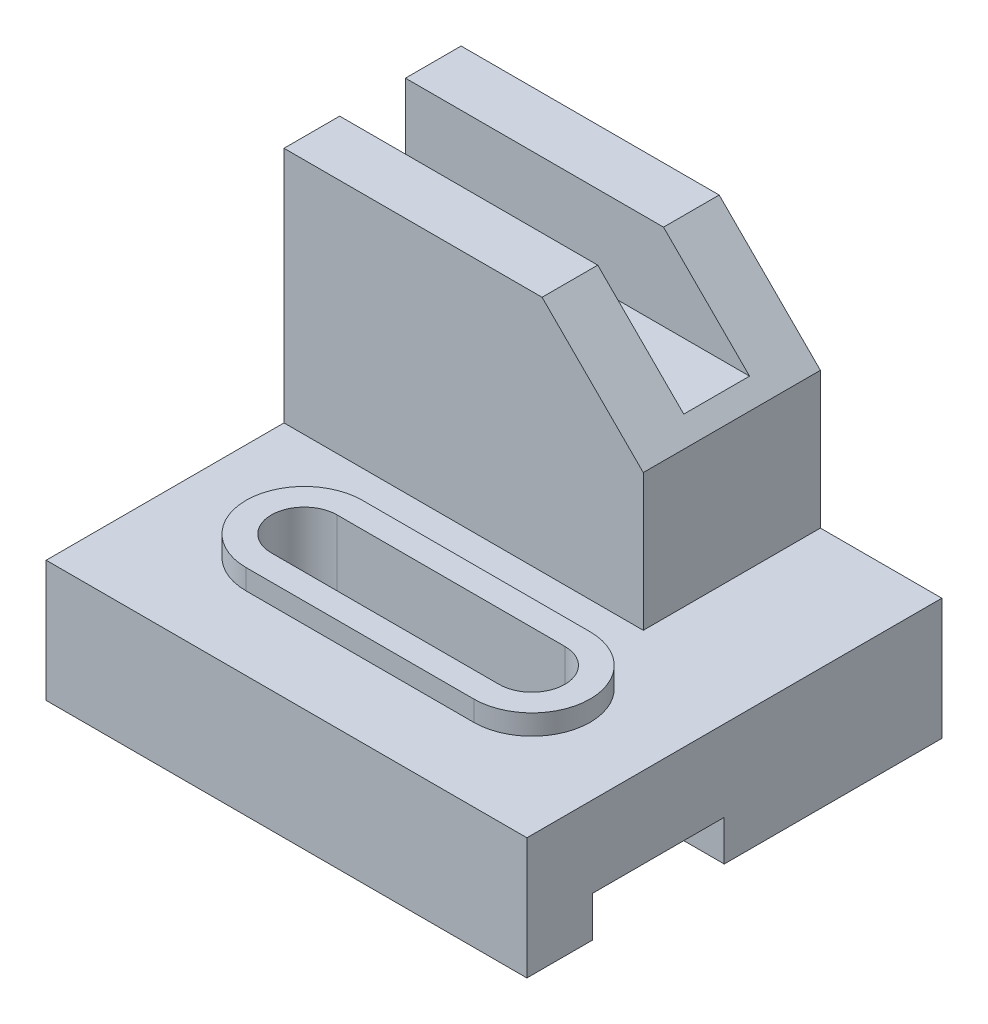
ISO-10303-21;
HEADER;
FILE_DESCRIPTION(('STEP AP214'),'2;1');
FILE_NAME('part.step','',(''),(''),'','','');
FILE_SCHEMA(('AUTOMOTIVE_DESIGN { 1 0 10303 214 1 1 1 1 }'));
ENDSEC;
DATA;
#1=APPLICATION_CONTEXT('core data for automotive mechanical design processes');
#2=APPLICATION_PROTOCOL_DEFINITION('international standard','automotive_design',2000,#1);
#3=PRODUCT_CONTEXT('',#1,'mechanical');
#4=PRODUCT('Part','Part','',(#3));
#5=PRODUCT_RELATED_PRODUCT_CATEGORY('part','',(#4));
#6=PRODUCT_DEFINITION_FORMATION('','',#4);
#7=PRODUCT_DEFINITION_CONTEXT('part definition',#1,'design');
#8=PRODUCT_DEFINITION('design','',#6,#7);
#9=PRODUCT_DEFINITION_SHAPE('','',#8);
#10=(LENGTH_UNIT() NAMED_UNIT(*) SI_UNIT(.MILLI.,.METRE.));
#11=(NAMED_UNIT(*) PLANE_ANGLE_UNIT() SI_UNIT($,.RADIAN.));
#12=(NAMED_UNIT(*) SI_UNIT($,.STERADIAN.) SOLID_ANGLE_UNIT());
#13=UNCERTAINTY_MEASURE_WITH_UNIT(LENGTH_MEASURE(1.E-05),#10,'distance_accuracy_value','');
#14=(GEOMETRIC_REPRESENTATION_CONTEXT(3) GLOBAL_UNCERTAINTY_ASSIGNED_CONTEXT((#13)) GLOBAL_UNIT_ASSIGNED_CONTEXT((#10,
#11,#12)) REPRESENTATION_CONTEXT('',''));
#15=CARTESIAN_POINT('',(0.,0.,0.));
#16=DIRECTION('',(0.,0.,1.));
#17=DIRECTION('',(1.,0.,0.));
#18=AXIS2_PLACEMENT_3D('',#15,#16,#17);
#19=CARTESIAN_POINT('',(0.,0.,0.));
#20=DIRECTION('',(0.,1.,0.));
#21=DIRECTION('',(0.,0.,1.));
#22=AXIS2_PLACEMENT_3D('',#19,#20,#21);
#23=PLANE('',#22);
#24=DIRECTION('',(1.,0.,0.));
#25=VECTOR('',#24,1.);
#26=CARTESIAN_POINT('',(-1.,0.,-39.));
#27=LINE('',#26,#25);
#28=CARTESIAN_POINT('',(0.,0.,-39.));
#29=VERTEX_POINT('',#28);
#30=CARTESIAN_POINT('',(95.,0.,-39.));
#31=VERTEX_POINT('',#30);
#32=EDGE_CURVE('E221',#29,#31,#27,.T.);
#33=ORIENTED_EDGE('',*,*,#32,.F.);
#34=DIRECTION('',(0.,0.,-1.));
#35=VECTOR('',#34,1.);
#36=CARTESIAN_POINT('',(0.,0.,0.));
#37=LINE('',#36,#35);
#38=CARTESIAN_POINT('',(0.,0.,-82.));
#39=VERTEX_POINT('',#38);
#40=EDGE_CURVE('E355',#29,#39,#37,.T.);
#41=ORIENTED_EDGE('',*,*,#40,.T.);
#42=DIRECTION('',(1.,0.,0.));
#43=VECTOR('',#42,1.);
#44=CARTESIAN_POINT('',(0.,0.,-82.));
#45=LINE('',#44,#43);
#46=CARTESIAN_POINT('',(95.,0.,-82.));
#47=VERTEX_POINT('',#46);
#48=EDGE_CURVE('E235',#39,#47,#45,.T.);
#49=ORIENTED_EDGE('',*,*,#48,.T.);
#50=DIRECTION('',(0.,0.,-1.));
#51=VECTOR('',#50,1.);
#52=CARTESIAN_POINT('',(95.,0.,0.));
#53=LINE('',#52,#51);
#54=EDGE_CURVE('E233',#31,#47,#53,.T.);
#55=ORIENTED_EDGE('',*,*,#54,.F.);
#56=EDGE_LOOP('',(#33,#41,#49,#55));
#57=FACE_BOUND('',#56,.T.);
#58=ADVANCED_FACE('F41',(#57),#23,.F.);
#59=CARTESIAN_POINT('',(95.,24.,0.));
#60=DIRECTION('',(-1.,0.,0.));
#61=DIRECTION('',(0.,0.,1.));
#62=AXIS2_PLACEMENT_3D('',#59,#60,#61);
#63=PLANE('',#62);
#64=DIRECTION('',(0.,-1.,0.));
#65=VECTOR('',#64,1.);
#66=CARTESIAN_POINT('',(95.,0.,-13.));
#67=LINE('',#66,#65);
#68=CARTESIAN_POINT('',(95.,8.,-13.));
#69=VERTEX_POINT('',#68);
#70=CARTESIAN_POINT('',(95.,0.,-13.));
#71=VERTEX_POINT('',#70);
#72=EDGE_CURVE('E201',#69,#71,#67,.T.);
#73=ORIENTED_EDGE('',*,*,#72,.F.);
#74=DIRECTION('',(0.,0.,1.));
#75=VECTOR('',#74,1.);
#76=CARTESIAN_POINT('',(95.,8.,-13.));
#77=LINE('',#76,#75);
#78=CARTESIAN_POINT('',(95.,8.00000000000001,-39.));
#79=VERTEX_POINT('',#78);
#80=EDGE_CURVE('E223',#79,#69,#77,.T.);
#81=ORIENTED_EDGE('',*,*,#80,.F.);
#82=DIRECTION('',(0.,1.,0.));
#83=VECTOR('',#82,1.);
#84=CARTESIAN_POINT('',(95.,0.,-39.));
#85=LINE('',#84,#83);
#86=EDGE_CURVE('E212',#31,#79,#85,.T.);
#87=ORIENTED_EDGE('',*,*,#86,.F.);
#88=ORIENTED_EDGE('',*,*,#54,.T.);
#89=DIRECTION('',(0.,-1.,0.));
#90=VECTOR('',#89,1.);
#91=CARTESIAN_POINT('',(95.,24.,-82.));
#92=LINE('',#91,#90);
#93=CARTESIAN_POINT('',(95.,24.,-82.));
#94=VERTEX_POINT('',#93);
#95=EDGE_CURVE('E245',#94,#47,#92,.T.);
#96=ORIENTED_EDGE('',*,*,#95,.F.);
#97=DIRECTION('',(0.,0.,-1.));
#98=VECTOR('',#97,1.);
#99=CARTESIAN_POINT('',(95.,24.,0.));
#100=LINE('',#99,#98);
#101=CARTESIAN_POINT('',(95.,24.,0.));
#102=VERTEX_POINT('',#101);
#103=EDGE_CURVE('E385',#102,#94,#100,.T.);
#104=ORIENTED_EDGE('',*,*,#103,.F.);
#105=DIRECTION('',(0.,-1.,0.));
#106=VECTOR('',#105,1.);
#107=CARTESIAN_POINT('',(95.,24.,0.));
#108=LINE('',#107,#106);
#109=CARTESIAN_POINT('',(95.,0.,0.));
#110=VERTEX_POINT('',#109);
#111=EDGE_CURVE('E231',#102,#110,#108,.T.);
#112=ORIENTED_EDGE('',*,*,#111,.T.);
#113=EDGE_CURVE('E222',#110,#71,#53,.T.);
#114=ORIENTED_EDGE('',*,*,#113,.T.);
#115=EDGE_LOOP('',(#73,#81,#87,#88,#96,#104,#112,#114));
#116=FACE_BOUND('',#115,.T.);
#117=ADVANCED_FACE('F227',(#116),#63,.F.);
#118=CARTESIAN_POINT('',(0.,24.,0.));
#119=DIRECTION('',(-1.,0.,0.));
#120=DIRECTION('',(0.,0.,1.));
#121=AXIS2_PLACEMENT_3D('',#118,#119,#120);
#122=PLANE('',#121);
#123=DIRECTION('',(0.,1.,0.));
#124=VECTOR('',#123,1.);
#125=CARTESIAN_POINT('',(0.,24.,-13.));
#126=LINE('',#125,#124);
#127=CARTESIAN_POINT('',(0.,0.,-13.));
#128=VERTEX_POINT('',#127);
#129=CARTESIAN_POINT('',(0.,8.,-13.));
#130=VERTEX_POINT('',#129);
#131=EDGE_CURVE('E251',#128,#130,#126,.T.);
#132=ORIENTED_EDGE('',*,*,#131,.F.);
#133=CARTESIAN_POINT('',(0.,0.,0.));
#134=VERTEX_POINT('',#133);
#135=EDGE_CURVE('E224',#134,#128,#37,.T.);
#136=ORIENTED_EDGE('',*,*,#135,.F.);
#137=DIRECTION('',(0.,-1.,0.));
#138=VECTOR('',#137,1.);
#139=CARTESIAN_POINT('',(0.,24.,0.));
#140=LINE('',#139,#138);
#141=CARTESIAN_POINT('',(0.,24.,0.));
#142=VERTEX_POINT('',#141);
#143=EDGE_CURVE('E250',#142,#134,#140,.T.);
#144=ORIENTED_EDGE('',*,*,#143,.F.);
#145=DIRECTION('',(0.,0.,-1.));
#146=VECTOR('',#145,1.);
#147=CARTESIAN_POINT('',(0.,24.,0.));
#148=LINE('',#147,#146);
#149=CARTESIAN_POINT('',(0.,24.,-47.));
#150=VERTEX_POINT('',#149);
#151=EDGE_CURVE('E380',#142,#150,#148,.T.);
#152=ORIENTED_EDGE('',*,*,#151,.T.);
#153=DIRECTION('',(0.,-1.,0.));
#154=VECTOR('',#153,1.);
#155=CARTESIAN_POINT('',(0.,71.,-47.));
#156=LINE('',#155,#154);
#157=CARTESIAN_POINT('',(0.,71.,-47.));
#158=VERTEX_POINT('',#157);
#159=EDGE_CURVE('E315',#158,#150,#156,.T.);
#160=ORIENTED_EDGE('',*,*,#159,.F.);
#161=DIRECTION('',(0.,0.,-1.));
#162=VECTOR('',#161,1.);
#163=CARTESIAN_POINT('',(0.,71.,0.));
#164=LINE('',#163,#162);
#165=CARTESIAN_POINT('',(0.,71.,-58.));
#166=VERTEX_POINT('',#165);
#167=EDGE_CURVE('E304',#158,#166,#164,.T.);
#168=ORIENTED_EDGE('',*,*,#167,.T.);
#169=DIRECTION('',(0.,-1.,0.));
#170=VECTOR('',#169,1.);
#171=CARTESIAN_POINT('',(0.,71.,-58.));
#172=LINE('',#171,#170);
#173=CARTESIAN_POINT('',(0.,54.,-58.));
#174=VERTEX_POINT('',#173);
#175=EDGE_CURVE('E314',#166,#174,#172,.T.);
#176=ORIENTED_EDGE('',*,*,#175,.T.);
#177=DIRECTION('',(0.,0.,-1.));
#178=VECTOR('',#177,1.);
#179=CARTESIAN_POINT('',(0.,54.,0.));
#180=LINE('',#179,#178);
#181=CARTESIAN_POINT('',(0.,54.,-71.));
#182=VERTEX_POINT('',#181);
#183=EDGE_CURVE('E279',#174,#182,#180,.T.);
#184=ORIENTED_EDGE('',*,*,#183,.T.);
#185=DIRECTION('',(0.,-1.,0.));
#186=VECTOR('',#185,1.);
#187=CARTESIAN_POINT('',(0.,71.,-71.));
#188=LINE('',#187,#186);
#189=CARTESIAN_POINT('',(0.,71.,-71.));
#190=VERTEX_POINT('',#189);
#191=EDGE_CURVE('E280',#190,#182,#188,.T.);
#192=ORIENTED_EDGE('',*,*,#191,.F.);
#193=DIRECTION('',(0.,0.,-1.));
#194=VECTOR('',#193,1.);
#195=CARTESIAN_POINT('',(0.,71.,0.));
#196=LINE('',#195,#194);
#197=CARTESIAN_POINT('',(0.,71.,-82.));
#198=VERTEX_POINT('',#197);
#199=EDGE_CURVE('E320',#190,#198,#196,.T.);
#200=ORIENTED_EDGE('',*,*,#199,.T.);
#201=DIRECTION('',(0.,-1.,0.));
#202=VECTOR('',#201,1.);
#203=CARTESIAN_POINT('',(0.,71.,-82.));
#204=LINE('',#203,#202);
#205=EDGE_CURVE('E293',#198,#39,#204,.T.);
#206=ORIENTED_EDGE('',*,*,#205,.T.);
#207=ORIENTED_EDGE('',*,*,#40,.F.);
#208=DIRECTION('',(0.,-1.,0.));
#209=VECTOR('',#208,1.);
#210=CARTESIAN_POINT('',(0.,24.,-39.));
#211=LINE('',#210,#209);
#212=CARTESIAN_POINT('',(0.,8.,-39.));
#213=VERTEX_POINT('',#212);
#214=EDGE_CURVE('E253',#213,#29,#211,.T.);
#215=ORIENTED_EDGE('',*,*,#214,.F.);
#216=DIRECTION('',(0.,0.,-1.));
#217=VECTOR('',#216,1.);
#218=CARTESIAN_POINT('',(0.,8.,0.));
#219=LINE('',#218,#217);
#220=EDGE_CURVE('E405',#130,#213,#219,.T.);
#221=ORIENTED_EDGE('',*,*,#220,.F.);
#222=EDGE_LOOP('',(#132,#136,#144,#152,#160,#168,#176,#184,#192,#200,#206,#207,#215,#221));
#223=FACE_BOUND('',#222,.T.);
#224=ADVANCED_FACE('F392',(#223),#122,.T.);
#225=CARTESIAN_POINT('',(0.,24.,0.));
#226=DIRECTION('',(0.,0.,-1.));
#227=DIRECTION('',(-1.,0.,0.));
#228=AXIS2_PLACEMENT_3D('',#225,#226,#227);
#229=PLANE('',#228);
#230=DIRECTION('',(1.,0.,0.));
#231=VECTOR('',#230,1.);
#232=CARTESIAN_POINT('',(0.,0.,0.));
#233=LINE('',#232,#231);
#234=EDGE_CURVE('E236',#134,#110,#233,.T.);
#235=ORIENTED_EDGE('',*,*,#234,.T.);
#236=ORIENTED_EDGE('',*,*,#111,.F.);
#237=DIRECTION('',(1.,0.,0.));
#238=VECTOR('',#237,1.);
#239=CARTESIAN_POINT('',(0.,24.,0.));
#240=LINE('',#239,#238);
#241=EDGE_CURVE('E379',#142,#102,#240,.T.);
#242=ORIENTED_EDGE('',*,*,#241,.F.);
#243=ORIENTED_EDGE('',*,*,#143,.T.);
#244=EDGE_LOOP('',(#235,#236,#242,#243));
#245=FACE_BOUND('',#244,.T.);
#246=ADVANCED_FACE('F427',(#245),#229,.F.);
#247=CARTESIAN_POINT('',(0.,24.,-82.));
#248=DIRECTION('',(0.,0.,-1.));
#249=DIRECTION('',(-1.,0.,0.));
#250=AXIS2_PLACEMENT_3D('',#247,#248,#249);
#251=PLANE('',#250);
#252=DIRECTION('',(1.,0.,0.));
#253=VECTOR('',#252,1.);
#254=CARTESIAN_POINT('',(0.,71.,-82.));
#255=LINE('',#254,#253);
#256=CARTESIAN_POINT('',(50.9999999999999,71.,-82.));
#257=VERTEX_POINT('',#256);
#258=EDGE_CURVE('E287',#198,#257,#255,.T.);
#259=ORIENTED_EDGE('',*,*,#258,.T.);
#260=DIRECTION('',(-0.707106781186548,0.707106781186547,0.));
#261=VECTOR('',#260,1.);
#262=CARTESIAN_POINT('',(48.9999999999999,73.,-82.));
#263=LINE('',#262,#261);
#264=CARTESIAN_POINT('',(71.,51.,-82.));
#265=VERTEX_POINT('',#264);
#266=EDGE_CURVE('E11',#257,#265,#263,.F.);
#267=ORIENTED_EDGE('',*,*,#266,.T.);
#268=DIRECTION('',(0.,-1.,0.));
#269=VECTOR('',#268,1.);
#270=CARTESIAN_POINT('',(71.,71.,-82.));
#271=LINE('',#270,#269);
#272=CARTESIAN_POINT('',(71.,24.,-82.));
#273=VERTEX_POINT('',#272);
#274=EDGE_CURVE('E290',#265,#273,#271,.T.);
#275=ORIENTED_EDGE('',*,*,#274,.T.);
#276=DIRECTION('',(1.,0.,0.));
#277=VECTOR('',#276,1.);
#278=CARTESIAN_POINT('',(0.,24.,-82.));
#279=LINE('',#278,#277);
#280=EDGE_CURVE('E244',#273,#94,#279,.T.);
#281=ORIENTED_EDGE('',*,*,#280,.T.);
#282=ORIENTED_EDGE('',*,*,#95,.T.);
#283=ORIENTED_EDGE('',*,*,#48,.F.);
#284=ORIENTED_EDGE('',*,*,#205,.F.);
#285=EDGE_LOOP('',(#259,#267,#275,#281,#282,#283,#284));
#286=FACE_BOUND('',#285,.T.);
#287=ADVANCED_FACE('F284',(#286),#251,.T.);
#288=CARTESIAN_POINT('',(0.,24.,0.));
#289=DIRECTION('',(0.,1.,0.));
#290=DIRECTION('',(0.,0.,1.));
#291=AXIS2_PLACEMENT_3D('',#288,#289,#290);
#292=PLANE('',#291);
#293=CARTESIAN_POINT('',(70.,24.,-26.));
#294=DIRECTION('',(0.,1.,0.));
#295=DIRECTION('',(0.,0.,1.));
#296=AXIS2_PLACEMENT_3D('',#293,#294,#295);
#297=CIRCLE('',#296,11.5);
#298=CARTESIAN_POINT('',(70.,24.,-14.5));
#299=VERTEX_POINT('',#298);
#300=CARTESIAN_POINT('',(70.,24.,-37.5));
#301=VERTEX_POINT('',#300);
#302=EDGE_CURVE('E237',#299,#301,#297,.T.);
#303=ORIENTED_EDGE('',*,*,#302,.F.);
#304=DIRECTION('',(1.,0.,0.));
#305=VECTOR('',#304,1.);
#306=CARTESIAN_POINT('',(0.,24.,-14.5));
#307=LINE('',#306,#305);
#308=CARTESIAN_POINT('',(25.,24.,-14.5));
#309=VERTEX_POINT('',#308);
#310=EDGE_CURVE('E364',#309,#299,#307,.T.);
#311=ORIENTED_EDGE('',*,*,#310,.F.);
#312=CARTESIAN_POINT('',(25.,24.,-26.));
#313=DIRECTION('',(0.,1.,0.));
#314=DIRECTION('',(0.,0.,1.));
#315=AXIS2_PLACEMENT_3D('',#312,#313,#314);
#316=CIRCLE('',#315,11.5);
#317=CARTESIAN_POINT('',(25.,24.,-37.5));
#318=VERTEX_POINT('',#317);
#319=EDGE_CURVE('E366',#318,#309,#316,.T.);
#320=ORIENTED_EDGE('',*,*,#319,.F.);
#321=DIRECTION('',(1.,0.,0.));
#322=VECTOR('',#321,1.);
#323=CARTESIAN_POINT('',(0.,24.,-37.5));
#324=LINE('',#323,#322);
#325=EDGE_CURVE('E371',#318,#301,#324,.T.);
#326=ORIENTED_EDGE('',*,*,#325,.T.);
#327=EDGE_LOOP('',(#303,#311,#320,#326));
#328=FACE_BOUND('',#327,.T.);
#329=DIRECTION('',(0.,0.,1.));
#330=VECTOR('',#329,1.);
#331=CARTESIAN_POINT('',(71.,24.,0.));
#332=LINE('',#331,#330);
#333=CARTESIAN_POINT('',(71.,24.,-47.));
#334=VERTEX_POINT('',#333);
#335=EDGE_CURVE('E291',#273,#334,#332,.T.);
#336=ORIENTED_EDGE('',*,*,#335,.T.);
#337=DIRECTION('',(-1.,0.,0.));
#338=VECTOR('',#337,1.);
#339=CARTESIAN_POINT('',(0.,24.,-47.));
#340=LINE('',#339,#338);
#341=EDGE_CURVE('E372',#334,#150,#340,.T.);
#342=ORIENTED_EDGE('',*,*,#341,.T.);
#343=ORIENTED_EDGE('',*,*,#151,.F.);
#344=ORIENTED_EDGE('',*,*,#241,.T.);
#345=ORIENTED_EDGE('',*,*,#103,.T.);
#346=ORIENTED_EDGE('',*,*,#280,.F.);
#347=EDGE_LOOP('',(#336,#342,#343,#344,#345,#346));
#348=FACE_BOUND('',#347,.T.);
#349=ADVANCED_FACE('F431',(#328,#348),#292,.T.);
#350=ORIENTED_EDGE('',*,*,#135,.T.);
#351=DIRECTION('',(1.,0.,0.));
#352=VECTOR('',#351,1.);
#353=CARTESIAN_POINT('',(-1.,0.,-13.));
#354=LINE('',#353,#352);
#355=EDGE_CURVE('E206',#128,#71,#354,.T.);
#356=ORIENTED_EDGE('',*,*,#355,.T.);
#357=ORIENTED_EDGE('',*,*,#113,.F.);
#358=ORIENTED_EDGE('',*,*,#234,.F.);
#359=EDGE_LOOP('',(#350,#356,#357,#358));
#360=FACE_BOUND('',#359,.T.);
#361=ADVANCED_FACE('F218',(#360),#23,.F.);
#362=CARTESIAN_POINT('',(0.,28.,-14.5));
#363=DIRECTION('',(0.,0.,-1.));
#364=DIRECTION('',(-1.,0.,0.));
#365=AXIS2_PLACEMENT_3D('',#362,#363,#364);
#366=PLANE('',#365);
#367=ORIENTED_EDGE('',*,*,#310,.T.);
#368=DIRECTION('',(0.,-1.,0.));
#369=VECTOR('',#368,1.);
#370=CARTESIAN_POINT('',(70.,28.,-14.5));
#371=LINE('',#370,#369);
#372=CARTESIAN_POINT('',(70.,28.,-14.5));
#373=VERTEX_POINT('',#372);
#374=EDGE_CURVE('E349',#373,#299,#371,.T.);
#375=ORIENTED_EDGE('',*,*,#374,.F.);
#376=DIRECTION('',(1.,0.,0.));
#377=VECTOR('',#376,1.);
#378=CARTESIAN_POINT('',(0.,28.,-14.5));
#379=LINE('',#378,#377);
#380=CARTESIAN_POINT('',(25.,28.,-14.5));
#381=VERTEX_POINT('',#380);
#382=EDGE_CURVE('E327',#381,#373,#379,.T.);
#383=ORIENTED_EDGE('',*,*,#382,.F.);
#384=DIRECTION('',(0.,-1.,0.));
#385=VECTOR('',#384,1.);
#386=CARTESIAN_POINT('',(25.,28.,-14.5));
#387=LINE('',#386,#385);
#388=EDGE_CURVE('E338',#381,#309,#387,.T.);
#389=ORIENTED_EDGE('',*,*,#388,.T.);
#390=EDGE_LOOP('',(#367,#375,#383,#389));
#391=FACE_BOUND('',#390,.T.);
#392=ADVANCED_FACE('F470',(#391),#366,.F.);
#393=CARTESIAN_POINT('',(70.,28.,-26.));
#394=DIRECTION('',(0.,-1.,0.));
#395=DIRECTION('',(0.,0.,-1.));
#396=AXIS2_PLACEMENT_3D('',#393,#394,#395);
#397=CYLINDRICAL_SURFACE('',#396,11.5);
#398=ORIENTED_EDGE('',*,*,#302,.T.);
#399=DIRECTION('',(0.,-1.,0.));
#400=VECTOR('',#399,1.);
#401=CARTESIAN_POINT('',(70.,28.,-37.5));
#402=LINE('',#401,#400);
#403=CARTESIAN_POINT('',(70.,28.,-37.5));
#404=VERTEX_POINT('',#403);
#405=EDGE_CURVE('E347',#404,#301,#402,.T.);
#406=ORIENTED_EDGE('',*,*,#405,.F.);
#407=CARTESIAN_POINT('',(70.,28.,-26.));
#408=DIRECTION('',(0.,1.,0.));
#409=DIRECTION('',(0.,0.,1.));
#410=AXIS2_PLACEMENT_3D('',#407,#408,#409);
#411=CIRCLE('',#410,11.5);
#412=EDGE_CURVE('E332',#373,#404,#411,.T.);
#413=ORIENTED_EDGE('',*,*,#412,.F.);
#414=ORIENTED_EDGE('',*,*,#374,.T.);
#415=EDGE_LOOP('',(#398,#406,#413,#414));
#416=FACE_BOUND('',#415,.T.);
#417=ADVANCED_FACE('F471',(#416),#397,.T.);
#418=CARTESIAN_POINT('',(0.,28.,-37.5));
#419=DIRECTION('',(0.,0.,-1.));
#420=DIRECTION('',(-1.,0.,0.));
#421=AXIS2_PLACEMENT_3D('',#418,#419,#420);
#422=PLANE('',#421);
#423=ORIENTED_EDGE('',*,*,#405,.T.);
#424=ORIENTED_EDGE('',*,*,#325,.F.);
#425=DIRECTION('',(0.,-1.,0.));
#426=VECTOR('',#425,1.);
#427=CARTESIAN_POINT('',(25.,28.,-37.5));
#428=LINE('',#427,#426);
#429=CARTESIAN_POINT('',(25.,28.,-37.5));
#430=VERTEX_POINT('',#429);
#431=EDGE_CURVE('E345',#430,#318,#428,.T.);
#432=ORIENTED_EDGE('',*,*,#431,.F.);
#433=DIRECTION('',(1.,0.,0.));
#434=VECTOR('',#433,1.);
#435=CARTESIAN_POINT('',(0.,28.,-37.5));
#436=LINE('',#435,#434);
#437=EDGE_CURVE('E334',#430,#404,#436,.T.);
#438=ORIENTED_EDGE('',*,*,#437,.T.);
#439=EDGE_LOOP('',(#423,#424,#432,#438));
#440=FACE_BOUND('',#439,.T.);
#441=ADVANCED_FACE('F483',(#440),#422,.T.);
#442=CARTESIAN_POINT('',(25.,28.,-26.));
#443=DIRECTION('',(0.,-1.,0.));
#444=DIRECTION('',(0.,0.,-1.));
#445=AXIS2_PLACEMENT_3D('',#442,#443,#444);
#446=CYLINDRICAL_SURFACE('',#445,6.5);
#447=CARTESIAN_POINT('',(25.,8.,-26.));
#448=DIRECTION('',(0.,1.,0.));
#449=DIRECTION('',(0.,0.,1.));
#450=AXIS2_PLACEMENT_3D('',#447,#448,#449);
#451=CIRCLE('',#450,6.5);
#452=CARTESIAN_POINT('',(25.,8.,-32.5));
#453=VERTEX_POINT('',#452);
#454=CARTESIAN_POINT('',(25.,8.,-19.5));
#455=VERTEX_POINT('',#454);
#456=EDGE_CURVE('E404',#453,#455,#451,.T.);
#457=ORIENTED_EDGE('',*,*,#456,.F.);
#458=DIRECTION('',(0.,-1.,0.));
#459=VECTOR('',#458,1.);
#460=CARTESIAN_POINT('',(25.,28.,-32.5));
#461=LINE('',#460,#459);
#462=CARTESIAN_POINT('',(25.,28.,-32.5));
#463=VERTEX_POINT('',#462);
#464=EDGE_CURVE('E343',#463,#453,#461,.T.);
#465=ORIENTED_EDGE('',*,*,#464,.F.);
#466=CARTESIAN_POINT('',(25.,28.,-26.));
#467=DIRECTION('',(0.,1.,0.));
#468=DIRECTION('',(0.,0.,1.));
#469=AXIS2_PLACEMENT_3D('',#466,#467,#468);
#470=CIRCLE('',#469,6.5);
#471=CARTESIAN_POINT('',(25.,28.,-19.5));
#472=VERTEX_POINT('',#471);
#473=EDGE_CURVE('E300',#463,#472,#470,.T.);
#474=ORIENTED_EDGE('',*,*,#473,.T.);
#475=DIRECTION('',(0.,-1.,0.));
#476=VECTOR('',#475,1.);
#477=CARTESIAN_POINT('',(25.,28.,-19.5));
#478=LINE('',#477,#476);
#479=EDGE_CURVE('E337',#472,#455,#478,.T.);
#480=ORIENTED_EDGE('',*,*,#479,.T.);
#481=EDGE_LOOP('',(#457,#465,#474,#480));
#482=FACE_BOUND('',#481,.T.);
#483=ADVANCED_FACE('F477',(#482),#446,.F.);
#484=CARTESIAN_POINT('',(0.,28.,-32.5));
#485=DIRECTION('',(0.,0.,-1.));
#486=DIRECTION('',(-1.,0.,0.));
#487=AXIS2_PLACEMENT_3D('',#484,#485,#486);
#488=PLANE('',#487);
#489=ORIENTED_EDGE('',*,*,#464,.T.);
#490=DIRECTION('',(1.,0.,0.));
#491=VECTOR('',#490,1.);
#492=CARTESIAN_POINT('',(0.,8.,-32.5));
#493=LINE('',#492,#491);
#494=CARTESIAN_POINT('',(70.,8.,-32.5));
#495=VERTEX_POINT('',#494);
#496=EDGE_CURVE('E406',#453,#495,#493,.T.);
#497=ORIENTED_EDGE('',*,*,#496,.T.);
#498=DIRECTION('',(0.,-1.,0.));
#499=VECTOR('',#498,1.);
#500=CARTESIAN_POINT('',(70.,28.,-32.5));
#501=LINE('',#500,#499);
#502=CARTESIAN_POINT('',(70.,28.,-32.5));
#503=VERTEX_POINT('',#502);
#504=EDGE_CURVE('E358',#503,#495,#501,.T.);
#505=ORIENTED_EDGE('',*,*,#504,.F.);
#506=DIRECTION('',(1.,0.,0.));
#507=VECTOR('',#506,1.);
#508=CARTESIAN_POINT('',(0.,28.,-32.5));
#509=LINE('',#508,#507);
#510=EDGE_CURVE('E319',#463,#503,#509,.T.);
#511=ORIENTED_EDGE('',*,*,#510,.F.);
#512=EDGE_LOOP('',(#489,#497,#505,#511));
#513=FACE_BOUND('',#512,.T.);
#514=ADVANCED_FACE('F485',(#513),#488,.F.);
#515=CARTESIAN_POINT('',(70.,28.,-26.));
#516=DIRECTION('',(0.,-1.,0.));
#517=DIRECTION('',(0.,0.,-1.));
#518=AXIS2_PLACEMENT_3D('',#515,#516,#517);
#519=CYLINDRICAL_SURFACE('',#518,6.5);
#520=CARTESIAN_POINT('',(70.,8.,-26.));
#521=DIRECTION('',(0.,1.,0.));
#522=DIRECTION('',(0.,0.,1.));
#523=AXIS2_PLACEMENT_3D('',#520,#521,#522);
#524=CIRCLE('',#523,6.5);
#525=CARTESIAN_POINT('',(70.,8.,-19.5));
#526=VERTEX_POINT('',#525);
#527=EDGE_CURVE('E408',#526,#495,#524,.T.);
#528=ORIENTED_EDGE('',*,*,#527,.F.);
#529=DIRECTION('',(0.,-1.,0.));
#530=VECTOR('',#529,1.);
#531=CARTESIAN_POINT('',(70.,28.,-19.5));
#532=LINE('',#531,#530);
#533=CARTESIAN_POINT('',(70.,28.,-19.5));
#534=VERTEX_POINT('',#533);
#535=EDGE_CURVE('E354',#534,#526,#532,.T.);
#536=ORIENTED_EDGE('',*,*,#535,.F.);
#537=CARTESIAN_POINT('',(70.,28.,-26.));
#538=DIRECTION('',(0.,1.,0.));
#539=DIRECTION('',(0.,0.,1.));
#540=AXIS2_PLACEMENT_3D('',#537,#538,#539);
#541=CIRCLE('',#540,6.5);
#542=EDGE_CURVE('E325',#534,#503,#541,.T.);
#543=ORIENTED_EDGE('',*,*,#542,.T.);
#544=ORIENTED_EDGE('',*,*,#504,.T.);
#545=EDGE_LOOP('',(#528,#536,#543,#544));
#546=FACE_BOUND('',#545,.T.);
#547=ADVANCED_FACE('F490',(#546),#519,.F.);
#548=CARTESIAN_POINT('',(0.,28.,-19.5));
#549=DIRECTION('',(0.,0.,-1.));
#550=DIRECTION('',(-1.,0.,0.));
#551=AXIS2_PLACEMENT_3D('',#548,#549,#550);
#552=PLANE('',#551);
#553=DIRECTION('',(1.,0.,0.));
#554=VECTOR('',#553,1.);
#555=CARTESIAN_POINT('',(0.,8.,-19.5));
#556=LINE('',#555,#554);
#557=EDGE_CURVE('E247',#455,#526,#556,.T.);
#558=ORIENTED_EDGE('',*,*,#557,.F.);
#559=ORIENTED_EDGE('',*,*,#479,.F.);
#560=DIRECTION('',(1.,0.,0.));
#561=VECTOR('',#560,1.);
#562=CARTESIAN_POINT('',(0.,28.,-19.5));
#563=LINE('',#562,#561);
#564=EDGE_CURVE('E324',#472,#534,#563,.T.);
#565=ORIENTED_EDGE('',*,*,#564,.T.);
#566=ORIENTED_EDGE('',*,*,#535,.T.);
#567=EDGE_LOOP('',(#558,#559,#565,#566));
#568=FACE_BOUND('',#567,.T.);
#569=ADVANCED_FACE('F491',(#568),#552,.T.);
#570=CARTESIAN_POINT('',(25.,28.,-26.));
#571=DIRECTION('',(0.,-1.,0.));
#572=DIRECTION('',(0.,0.,-1.));
#573=AXIS2_PLACEMENT_3D('',#570,#571,#572);
#574=CYLINDRICAL_SURFACE('',#573,11.5);
#575=ORIENTED_EDGE('',*,*,#319,.T.);
#576=ORIENTED_EDGE('',*,*,#388,.F.);
#577=CARTESIAN_POINT('',(25.,28.,-26.));
#578=DIRECTION('',(0.,1.,0.));
#579=DIRECTION('',(0.,0.,1.));
#580=AXIS2_PLACEMENT_3D('',#577,#578,#579);
#581=CIRCLE('',#580,11.5);
#582=EDGE_CURVE('E336',#430,#381,#581,.T.);
#583=ORIENTED_EDGE('',*,*,#582,.F.);
#584=ORIENTED_EDGE('',*,*,#431,.T.);
#585=EDGE_LOOP('',(#575,#576,#583,#584));
#586=FACE_BOUND('',#585,.T.);
#587=ADVANCED_FACE('F452',(#586),#574,.T.);
#588=CARTESIAN_POINT('',(0.,28.,0.));
#589=DIRECTION('',(0.,1.,0.));
#590=DIRECTION('',(0.,0.,1.));
#591=AXIS2_PLACEMENT_3D('',#588,#589,#590);
#592=PLANE('',#591);
#593=ORIENTED_EDGE('',*,*,#473,.F.);
#594=ORIENTED_EDGE('',*,*,#510,.T.);
#595=ORIENTED_EDGE('',*,*,#542,.F.);
#596=ORIENTED_EDGE('',*,*,#564,.F.);
#597=EDGE_LOOP('',(#593,#594,#595,#596));
#598=FACE_BOUND('',#597,.T.);
#599=ORIENTED_EDGE('',*,*,#382,.T.);
#600=ORIENTED_EDGE('',*,*,#412,.T.);
#601=ORIENTED_EDGE('',*,*,#437,.F.);
#602=ORIENTED_EDGE('',*,*,#582,.T.);
#603=EDGE_LOOP('',(#599,#600,#601,#602));
#604=FACE_BOUND('',#603,.T.);
#605=ADVANCED_FACE('F446',(#598,#604),#592,.T.);
#606=CARTESIAN_POINT('',(0.,71.,-58.));
#607=DIRECTION('',(0.,0.,1.));
#608=DIRECTION('',(1.,0.,0.));
#609=AXIS2_PLACEMENT_3D('',#606,#607,#608);
#610=PLANE('',#609);
#611=DIRECTION('',(-1.,0.,0.));
#612=VECTOR('',#611,1.);
#613=CARTESIAN_POINT('',(0.,71.,-58.));
#614=LINE('',#613,#612);
#615=CARTESIAN_POINT('',(50.9999999999999,71.,-58.));
#616=VERTEX_POINT('',#615);
#617=EDGE_CURVE('E303',#616,#166,#614,.T.);
#618=ORIENTED_EDGE('',*,*,#617,.F.);
#619=DIRECTION('',(-0.707106781186548,0.707106781186547,0.));
#620=VECTOR('',#619,1.);
#621=CARTESIAN_POINT('',(71.,51.,-58.));
#622=LINE('',#621,#620);
#623=CARTESIAN_POINT('',(68.,54.,-58.));
#624=VERTEX_POINT('',#623);
#625=EDGE_CURVE('E261',#616,#624,#622,.F.);
#626=ORIENTED_EDGE('',*,*,#625,.T.);
#627=DIRECTION('',(-1.,0.,0.));
#628=VECTOR('',#627,1.);
#629=CARTESIAN_POINT('',(0.,54.,-58.));
#630=LINE('',#629,#628);
#631=EDGE_CURVE('E275',#624,#174,#630,.T.);
#632=ORIENTED_EDGE('',*,*,#631,.T.);
#633=ORIENTED_EDGE('',*,*,#175,.F.);
#634=EDGE_LOOP('',(#618,#626,#632,#633));
#635=FACE_BOUND('',#634,.T.);
#636=ADVANCED_FACE('F441',(#635),#610,.F.);
#637=CARTESIAN_POINT('',(0.,71.,-47.));
#638=DIRECTION('',(0.,0.,1.));
#639=DIRECTION('',(1.,0.,0.));
#640=AXIS2_PLACEMENT_3D('',#637,#638,#639);
#641=PLANE('',#640);
#642=DIRECTION('',(0.,-1.,0.));
#643=VECTOR('',#642,1.);
#644=CARTESIAN_POINT('',(71.,71.,-47.));
#645=LINE('',#644,#643);
#646=CARTESIAN_POINT('',(71.,51.,-47.));
#647=VERTEX_POINT('',#646);
#648=EDGE_CURVE('E309',#647,#334,#645,.T.);
#649=ORIENTED_EDGE('',*,*,#648,.F.);
#650=DIRECTION('',(0.707106781186548,-0.707106781186547,0.));
#651=VECTOR('',#650,1.);
#652=CARTESIAN_POINT('',(25.4999999999999,96.5,-47.));
#653=LINE('',#652,#651);
#654=CARTESIAN_POINT('',(50.9999999999999,71.,-47.));
#655=VERTEX_POINT('',#654);
#656=EDGE_CURVE('E260',#647,#655,#653,.F.);
#657=ORIENTED_EDGE('',*,*,#656,.T.);
#658=DIRECTION('',(-1.,0.,0.));
#659=VECTOR('',#658,1.);
#660=CARTESIAN_POINT('',(0.,71.,-47.));
#661=LINE('',#660,#659);
#662=EDGE_CURVE('E306',#655,#158,#661,.T.);
#663=ORIENTED_EDGE('',*,*,#662,.T.);
#664=ORIENTED_EDGE('',*,*,#159,.T.);
#665=ORIENTED_EDGE('',*,*,#341,.F.);
#666=EDGE_LOOP('',(#649,#657,#663,#664,#665));
#667=FACE_BOUND('',#666,.T.);
#668=ADVANCED_FACE('F434',(#667),#641,.T.);
#669=CARTESIAN_POINT('',(0.,71.,0.));
#670=DIRECTION('',(0.,1.,0.));
#671=DIRECTION('',(0.,0.,1.));
#672=AXIS2_PLACEMENT_3D('',#669,#670,#671);
#673=PLANE('',#672);
#674=ORIENTED_EDGE('',*,*,#662,.F.);
#675=DIRECTION('',(0.,0.,-1.));
#676=VECTOR('',#675,1.);
#677=CARTESIAN_POINT('',(50.9999999999999,71.,0.));
#678=LINE('',#677,#676);
#679=EDGE_CURVE('E259',#655,#616,#678,.T.);
#680=ORIENTED_EDGE('',*,*,#679,.T.);
#681=ORIENTED_EDGE('',*,*,#617,.T.);
#682=ORIENTED_EDGE('',*,*,#167,.F.);
#683=EDGE_LOOP('',(#674,#680,#681,#682));
#684=FACE_BOUND('',#683,.T.);
#685=ADVANCED_FACE('F438',(#684),#673,.T.);
#686=CARTESIAN_POINT('',(0.,71.,-71.));
#687=DIRECTION('',(0.,0.,-1.));
#688=DIRECTION('',(-1.,0.,0.));
#689=AXIS2_PLACEMENT_3D('',#686,#687,#688);
#690=PLANE('',#689);
#691=DIRECTION('',(1.,0.,0.));
#692=VECTOR('',#691,1.);
#693=CARTESIAN_POINT('',(0.,54.,-71.));
#694=LINE('',#693,#692);
#695=CARTESIAN_POINT('',(68.,54.,-71.));
#696=VERTEX_POINT('',#695);
#697=EDGE_CURVE('E269',#182,#696,#694,.T.);
#698=ORIENTED_EDGE('',*,*,#697,.T.);
#699=DIRECTION('',(0.707106781186548,-0.707106781186547,0.));
#700=VECTOR('',#699,1.);
#701=CARTESIAN_POINT('',(71.,51.,-71.));
#702=LINE('',#701,#700);
#703=CARTESIAN_POINT('',(50.9999999999999,71.,-71.));
#704=VERTEX_POINT('',#703);
#705=EDGE_CURVE('E63',#696,#704,#702,.F.);
#706=ORIENTED_EDGE('',*,*,#705,.T.);
#707=DIRECTION('',(1.,0.,0.));
#708=VECTOR('',#707,1.);
#709=CARTESIAN_POINT('',(0.,71.,-71.));
#710=LINE('',#709,#708);
#711=EDGE_CURVE('E394',#190,#704,#710,.T.);
#712=ORIENTED_EDGE('',*,*,#711,.F.);
#713=ORIENTED_EDGE('',*,*,#191,.T.);
#714=EDGE_LOOP('',(#698,#706,#712,#713));
#715=FACE_BOUND('',#714,.T.);
#716=ADVANCED_FACE('F277',(#715),#690,.F.);
#717=CARTESIAN_POINT('',(71.,71.,0.));
#718=DIRECTION('',(1.,0.,0.));
#719=DIRECTION('',(0.,0.,-1.));
#720=AXIS2_PLACEMENT_3D('',#717,#718,#719);
#721=PLANE('',#720);
#722=DIRECTION('',(0.,0.,1.));
#723=VECTOR('',#722,1.);
#724=CARTESIAN_POINT('',(71.,51.,0.));
#725=LINE('',#724,#723);
#726=EDGE_CURVE('E254',#265,#647,#725,.T.);
#727=ORIENTED_EDGE('',*,*,#726,.T.);
#728=ORIENTED_EDGE('',*,*,#648,.T.);
#729=ORIENTED_EDGE('',*,*,#335,.F.);
#730=ORIENTED_EDGE('',*,*,#274,.F.);
#731=EDGE_LOOP('',(#727,#728,#729,#730));
#732=FACE_BOUND('',#731,.T.);
#733=ADVANCED_FACE('F292',(#732),#721,.T.);
#734=CARTESIAN_POINT('',(0.,71.,0.));
#735=DIRECTION('',(0.,1.,0.));
#736=DIRECTION('',(0.,0.,1.));
#737=AXIS2_PLACEMENT_3D('',#734,#735,#736);
#738=PLANE('',#737);
#739=ORIENTED_EDGE('',*,*,#711,.T.);
#740=DIRECTION('',(0.,0.,-1.));
#741=VECTOR('',#740,1.);
#742=CARTESIAN_POINT('',(50.9999999999999,71.,0.));
#743=LINE('',#742,#741);
#744=EDGE_CURVE('E49',#704,#257,#743,.T.);
#745=ORIENTED_EDGE('',*,*,#744,.T.);
#746=ORIENTED_EDGE('',*,*,#258,.F.);
#747=ORIENTED_EDGE('',*,*,#199,.F.);
#748=EDGE_LOOP('',(#739,#745,#746,#747));
#749=FACE_BOUND('',#748,.T.);
#750=ADVANCED_FACE('F400',(#749),#738,.T.);
#751=CARTESIAN_POINT('',(0.,54.,0.));
#752=DIRECTION('',(0.,1.,0.));
#753=DIRECTION('',(0.,0.,1.));
#754=AXIS2_PLACEMENT_3D('',#751,#752,#753);
#755=PLANE('',#754);
#756=ORIENTED_EDGE('',*,*,#631,.F.);
#757=DIRECTION('',(0.,0.,1.));
#758=VECTOR('',#757,1.);
#759=CARTESIAN_POINT('',(68.,54.,0.));
#760=LINE('',#759,#758);
#761=EDGE_CURVE('E262',#624,#696,#760,.F.);
#762=ORIENTED_EDGE('',*,*,#761,.T.);
#763=ORIENTED_EDGE('',*,*,#697,.F.);
#764=ORIENTED_EDGE('',*,*,#183,.F.);
#765=EDGE_LOOP('',(#756,#762,#763,#764));
#766=FACE_BOUND('',#765,.T.);
#767=ADVANCED_FACE('F268',(#766),#755,.T.);
#768=CARTESIAN_POINT('',(-1.,0.,-13.));
#769=DIRECTION('',(0.,0.,1.));
#770=DIRECTION('',(1.,0.,0.));
#771=AXIS2_PLACEMENT_3D('',#768,#769,#770);
#772=PLANE('',#771);
#773=ORIENTED_EDGE('',*,*,#131,.T.);
#774=DIRECTION('',(1.,0.,0.));
#775=VECTOR('',#774,1.);
#776=CARTESIAN_POINT('',(-1.,8.,-13.));
#777=LINE('',#776,#775);
#778=EDGE_CURVE('E207',#130,#69,#777,.T.);
#779=ORIENTED_EDGE('',*,*,#778,.T.);
#780=ORIENTED_EDGE('',*,*,#72,.T.);
#781=ORIENTED_EDGE('',*,*,#355,.F.);
#782=EDGE_LOOP('',(#773,#779,#780,#781));
#783=FACE_BOUND('',#782,.T.);
#784=ADVANCED_FACE('F202',(#783),#772,.F.);
#785=CARTESIAN_POINT('',(-1.,8.,-13.));
#786=DIRECTION('',(0.,1.,0.));
#787=DIRECTION('',(0.,0.,1.));
#788=AXIS2_PLACEMENT_3D('',#785,#786,#787);
#789=PLANE('',#788);
#790=ORIENTED_EDGE('',*,*,#220,.T.);
#791=DIRECTION('',(1.,0.,0.));
#792=VECTOR('',#791,1.);
#793=CARTESIAN_POINT('',(-1.,8.,-39.));
#794=LINE('',#793,#792);
#795=EDGE_CURVE('E415',#213,#79,#794,.T.);
#796=ORIENTED_EDGE('',*,*,#795,.T.);
#797=ORIENTED_EDGE('',*,*,#80,.T.);
#798=ORIENTED_EDGE('',*,*,#778,.F.);
#799=EDGE_LOOP('',(#790,#796,#797,#798));
#800=FACE_BOUND('',#799,.T.);
#801=ORIENTED_EDGE('',*,*,#456,.T.);
#802=ORIENTED_EDGE('',*,*,#557,.T.);
#803=ORIENTED_EDGE('',*,*,#527,.T.);
#804=ORIENTED_EDGE('',*,*,#496,.F.);
#805=EDGE_LOOP('',(#801,#802,#803,#804));
#806=FACE_BOUND('',#805,.T.);
#807=ADVANCED_FACE('F425',(#800,#806),#789,.F.);
#808=CARTESIAN_POINT('',(-1.,0.,-39.));
#809=DIRECTION('',(0.,0.,-1.));
#810=DIRECTION('',(-1.,0.,0.));
#811=AXIS2_PLACEMENT_3D('',#808,#809,#810);
#812=PLANE('',#811);
#813=ORIENTED_EDGE('',*,*,#214,.T.);
#814=ORIENTED_EDGE('',*,*,#32,.T.);
#815=ORIENTED_EDGE('',*,*,#86,.T.);
#816=ORIENTED_EDGE('',*,*,#795,.F.);
#817=EDGE_LOOP('',(#813,#814,#815,#816));
#818=FACE_BOUND('',#817,.T.);
#819=ADVANCED_FACE('F419',(#818),#812,.F.);
#820=CARTESIAN_POINT('',(71.,51.,0.));
#821=DIRECTION('',(-0.707106781186547,-0.707106781186548,0.));
#822=DIRECTION('',(0.,0.,1.));
#823=AXIS2_PLACEMENT_3D('',#820,#821,#822);
#824=PLANE('',#823);
#825=ORIENTED_EDGE('',*,*,#705,.F.);
#826=ORIENTED_EDGE('',*,*,#761,.F.);
#827=ORIENTED_EDGE('',*,*,#625,.F.);
#828=ORIENTED_EDGE('',*,*,#679,.F.);
#829=ORIENTED_EDGE('',*,*,#656,.F.);
#830=ORIENTED_EDGE('',*,*,#726,.F.);
#831=ORIENTED_EDGE('',*,*,#266,.F.);
#832=ORIENTED_EDGE('',*,*,#744,.F.);
#833=EDGE_LOOP('',(#825,#826,#827,#828,#829,#830,#831,#832));
#834=FACE_BOUND('',#833,.T.);
#835=ADVANCED_FACE('F42',(#834),#824,.F.);
#836=CLOSED_SHELL('',(#58,#117,#224,#246,#287,#349,#361,#392,#417,#441,#483,#514,#547,#569,#587,
#605,#636,#668,#685,#716,#733,#750,#767,#784,#807,#819,#835));
#837=MANIFOLD_SOLID_BREP('B2',#836);
#838=ADVANCED_BREP_SHAPE_REPRESENTATION('',(#18,#837),#14);
#839=SHAPE_DEFINITION_REPRESENTATION(#9,#838);
ENDSEC;
END-ISO-10303-21;
